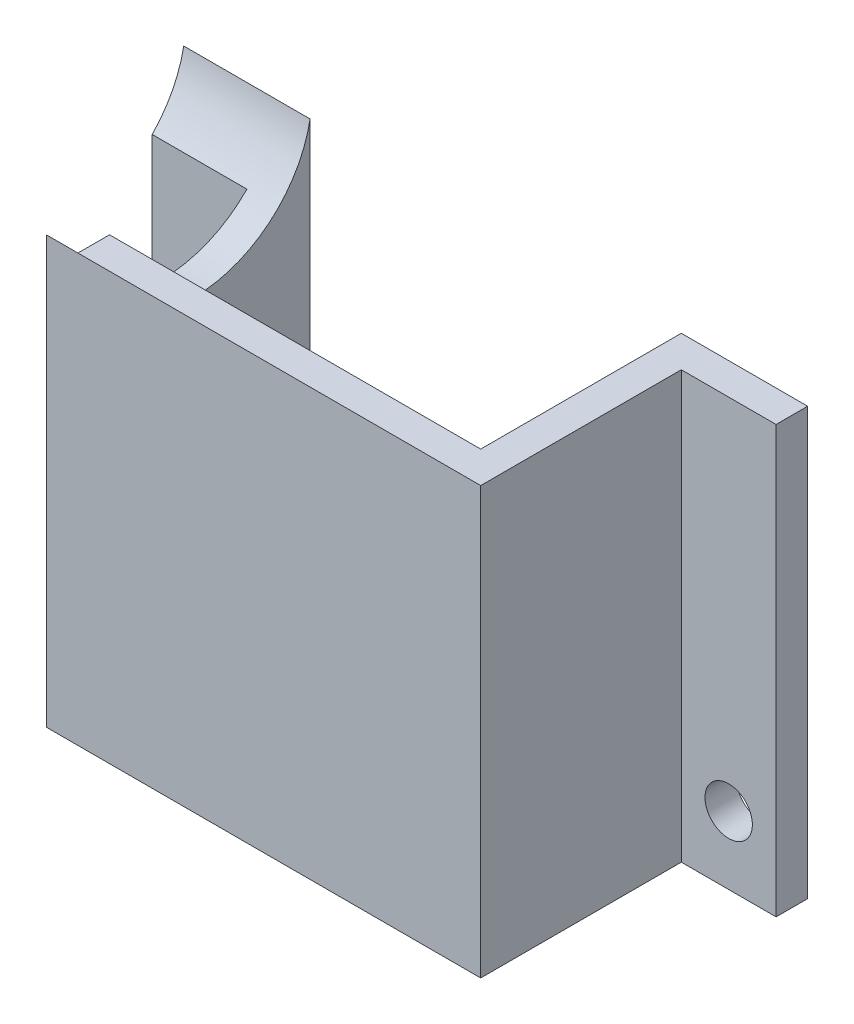
ISO-10303-21;
HEADER;
FILE_DESCRIPTION(('STEP AP214'),'2;1');
FILE_NAME('part.step','',(''),(''),'','','');
FILE_SCHEMA(('AUTOMOTIVE_DESIGN { 1 0 10303 214 1 1 1 1 }'));
ENDSEC;
DATA;
#1=APPLICATION_CONTEXT('core data for automotive mechanical design processes');
#2=APPLICATION_PROTOCOL_DEFINITION('international standard','automotive_design',2000,#1);
#3=PRODUCT_CONTEXT('',#1,'mechanical');
#4=PRODUCT('Part','Part','',(#3));
#5=PRODUCT_RELATED_PRODUCT_CATEGORY('part','',(#4));
#6=PRODUCT_DEFINITION_FORMATION('','',#4);
#7=PRODUCT_DEFINITION_CONTEXT('part definition',#1,'design');
#8=PRODUCT_DEFINITION('design','',#6,#7);
#9=PRODUCT_DEFINITION_SHAPE('','',#8);
#10=(LENGTH_UNIT() NAMED_UNIT(*) SI_UNIT(.MILLI.,.METRE.));
#11=(NAMED_UNIT(*) PLANE_ANGLE_UNIT() SI_UNIT($,.RADIAN.));
#12=(NAMED_UNIT(*) SI_UNIT($,.STERADIAN.) SOLID_ANGLE_UNIT());
#13=UNCERTAINTY_MEASURE_WITH_UNIT(LENGTH_MEASURE(1.E-05),#10,'distance_accuracy_value','');
#14=(GEOMETRIC_REPRESENTATION_CONTEXT(3) GLOBAL_UNCERTAINTY_ASSIGNED_CONTEXT((#13)) GLOBAL_UNIT_ASSIGNED_CONTEXT((#10,
#11,#12)) REPRESENTATION_CONTEXT('',''));
#15=CARTESIAN_POINT('',(0.,0.,0.));
#16=DIRECTION('',(0.,0.,1.));
#17=DIRECTION('',(1.,0.,0.));
#18=AXIS2_PLACEMENT_3D('',#15,#16,#17);
#19=CARTESIAN_POINT('',(-18.2057416267943,-20.2177033492823,12.7));
#20=DIRECTION('',(1.,0.,0.));
#21=DIRECTION('',(0.,0.,-1.));
#22=AXIS2_PLACEMENT_3D('',#19,#20,#21);
#23=PLANE('',#22);
#24=CARTESIAN_POINT('',(-18.2057416267943,8.15687405460447,7.35));
#25=DIRECTION('',(1.,0.,0.));
#26=DIRECTION('',(0.,0.,-1.));
#27=AXIS2_PLACEMENT_3D('',#24,#25,#26);
#28=CIRCLE('',#27,7.47743024302307);
#29=CARTESIAN_POINT('',(-18.2057416267943,6.7822966507177,0.));
#30=VERTEX_POINT('',#29);
#31=CARTESIAN_POINT('',(-18.2057416267943,2.93294229401685,2.));
#32=VERTEX_POINT('',#31);
#33=EDGE_CURVE('E317',#30,#32,#28,.F.);
#34=ORIENTED_EDGE('',*,*,#33,.F.);
#35=DIRECTION('',(0.,-1.,0.));
#36=VECTOR('',#35,1.);
#37=CARTESIAN_POINT('',(-18.2057416267943,-20.2177033492823,0.));
#38=LINE('',#37,#36);
#39=CARTESIAN_POINT('',(-18.2057416267943,-20.2177033492823,0.));
#40=VERTEX_POINT('',#39);
#41=EDGE_CURVE('E196',#30,#40,#38,.T.);
#42=ORIENTED_EDGE('',*,*,#41,.T.);
#43=DIRECTION('',(0.,0.,-1.));
#44=VECTOR('',#43,1.);
#45=CARTESIAN_POINT('',(-18.2057416267943,-20.2177033492823,12.7));
#46=LINE('',#45,#44);
#47=CARTESIAN_POINT('',(-18.2057416267943,-20.2177033492823,2.));
#48=VERTEX_POINT('',#47);
#49=EDGE_CURVE('E48',#48,#40,#46,.T.);
#50=ORIENTED_EDGE('',*,*,#49,.F.);
#51=DIRECTION('',(0.,1.,0.));
#52=VECTOR('',#51,1.);
#53=CARTESIAN_POINT('',(-18.2057416267943,-20.2177033492823,2.));
#54=LINE('',#53,#52);
#55=EDGE_CURVE('E203',#48,#32,#54,.T.);
#56=ORIENTED_EDGE('',*,*,#55,.T.);
#57=EDGE_LOOP('',(#34,#42,#50,#56));
#58=FACE_BOUND('',#57,.T.);
#59=ADVANCED_FACE('F39',(#58),#23,.F.);
#60=CARTESIAN_POINT('',(13.2942583732057,6.78229665071771,12.7));
#61=DIRECTION('',(0.,-1.,0.));
#62=DIRECTION('',(0.,0.,-1.));
#63=AXIS2_PLACEMENT_3D('',#60,#61,#62);
#64=PLANE('',#63);
#65=DIRECTION('',(0.,0.,-1.));
#66=VECTOR('',#65,1.);
#67=CARTESIAN_POINT('',(-10.2057416267943,6.78229665071771,12.7));
#68=LINE('',#67,#66);
#69=CARTESIAN_POINT('',(-10.2057416267943,6.78229665071771,14.7));
#70=VERTEX_POINT('',#69);
#71=CARTESIAN_POINT('',(-10.2057416267943,6.78229665071771,12.7));
#72=VERTEX_POINT('',#71);
#73=EDGE_CURVE('E161',#70,#72,#68,.T.);
#74=ORIENTED_EDGE('',*,*,#73,.F.);
#75=DIRECTION('',(-1.,0.,0.));
#76=VECTOR('',#75,1.);
#77=CARTESIAN_POINT('',(-18.2057416267943,6.78229665071771,14.7));
#78=LINE('',#77,#76);
#79=CARTESIAN_POINT('',(15.2942583732057,6.78229665071771,14.7));
#80=VERTEX_POINT('',#79);
#81=EDGE_CURVE('E182',#80,#70,#78,.T.);
#82=ORIENTED_EDGE('',*,*,#81,.F.);
#83=DIRECTION('',(0.,0.,1.));
#84=VECTOR('',#83,1.);
#85=CARTESIAN_POINT('',(15.2942583732057,6.78229665071771,14.7));
#86=LINE('',#85,#84);
#87=CARTESIAN_POINT('',(15.2942583732057,6.78229665071771,2.));
#88=VERTEX_POINT('',#87);
#89=EDGE_CURVE('E62',#88,#80,#86,.T.);
#90=ORIENTED_EDGE('',*,*,#89,.F.);
#91=DIRECTION('',(-1.,0.,0.));
#92=VECTOR('',#91,1.);
#93=CARTESIAN_POINT('',(15.2942583732057,6.78229665071771,2.));
#94=LINE('',#93,#92);
#95=CARTESIAN_POINT('',(21.2942583732058,6.78229665071771,2.));
#96=VERTEX_POINT('',#95);
#97=EDGE_CURVE('E339',#96,#88,#94,.T.);
#98=ORIENTED_EDGE('',*,*,#97,.F.);
#99=DIRECTION('',(0.,0.,-1.));
#100=VECTOR('',#99,1.);
#101=CARTESIAN_POINT('',(21.2942583732057,6.78229665071771,12.7));
#102=LINE('',#101,#100);
#103=CARTESIAN_POINT('',(21.2942583732057,6.78229665071771,0.));
#104=VERTEX_POINT('',#103);
#105=EDGE_CURVE('E296',#96,#104,#102,.T.);
#106=ORIENTED_EDGE('',*,*,#105,.T.);
#107=DIRECTION('',(-1.,0.,0.));
#108=VECTOR('',#107,1.);
#109=CARTESIAN_POINT('',(13.2942583732057,6.78229665071771,0.));
#110=LINE('',#109,#108);
#111=CARTESIAN_POINT('',(13.2942583732057,6.78229665071771,0.));
#112=VERTEX_POINT('',#111);
#113=EDGE_CURVE('E245',#104,#112,#110,.T.);
#114=ORIENTED_EDGE('',*,*,#113,.T.);
#115=DIRECTION('',(0.,0.,-1.));
#116=VECTOR('',#115,1.);
#117=CARTESIAN_POINT('',(13.2942583732057,6.78229665071771,12.7));
#118=LINE('',#117,#116);
#119=CARTESIAN_POINT('',(13.2942583732057,6.78229665071771,12.7));
#120=VERTEX_POINT('',#119);
#121=EDGE_CURVE('E292',#120,#112,#118,.T.);
#122=ORIENTED_EDGE('',*,*,#121,.F.);
#123=DIRECTION('',(-1.,0.,0.));
#124=VECTOR('',#123,1.);
#125=CARTESIAN_POINT('',(-18.2057416267943,6.78229665071771,12.7));
#126=LINE('',#125,#124);
#127=EDGE_CURVE('E184',#120,#72,#126,.T.);
#128=ORIENTED_EDGE('',*,*,#127,.T.);
#129=EDGE_LOOP('',(#74,#82,#90,#98,#106,#114,#122,#128));
#130=FACE_BOUND('',#129,.T.);
#131=ADVANCED_FACE('F181',(#130),#64,.F.);
#132=CARTESIAN_POINT('',(-10.2057416267943,6.78229665071771,12.7));
#133=DIRECTION('',(-1.,0.,0.));
#134=DIRECTION('',(0.,-1.,0.));
#135=AXIS2_PLACEMENT_3D('',#132,#133,#134);
#136=PLANE('',#135);
#137=CARTESIAN_POINT('',(-10.2057416267943,8.15687405460447,7.35));
#138=DIRECTION('',(-1.,0.,0.));
#139=DIRECTION('',(0.,-1.,0.));
#140=AXIS2_PLACEMENT_3D('',#137,#138,#139);
#141=CIRCLE('',#140,7.47743024302307);
#142=CARTESIAN_POINT('',(-10.2057416267943,6.7822966507177,0.));
#143=VERTEX_POINT('',#142);
#144=CARTESIAN_POINT('',(-10.2057416267943,2.93294229401685,12.7));
#145=VERTEX_POINT('',#144);
#146=EDGE_CURVE('E166',#143,#145,#141,.T.);
#147=ORIENTED_EDGE('',*,*,#146,.T.);
#148=DIRECTION('',(0.,1.,0.));
#149=VECTOR('',#148,1.);
#150=CARTESIAN_POINT('',(-10.2057416267943,6.78229665071771,12.7));
#151=LINE('',#150,#149);
#152=CARTESIAN_POINT('',(-10.2057416267943,-6.7177033492823,12.7));
#153=VERTEX_POINT('',#152);
#154=EDGE_CURVE('E229',#153,#145,#151,.T.);
#155=ORIENTED_EDGE('',*,*,#154,.F.);
#156=DIRECTION('',(0.,0.,-1.));
#157=VECTOR('',#156,1.);
#158=CARTESIAN_POINT('',(-10.2057416267943,-6.7177033492823,12.7));
#159=LINE('',#158,#157);
#160=CARTESIAN_POINT('',(-10.2057416267943,-6.7177033492823,0.));
#161=VERTEX_POINT('',#160);
#162=EDGE_CURVE('E232',#153,#161,#159,.T.);
#163=ORIENTED_EDGE('',*,*,#162,.T.);
#164=DIRECTION('',(0.,1.,0.));
#165=VECTOR('',#164,1.);
#166=CARTESIAN_POINT('',(-10.2057416267943,6.78229665071771,0.));
#167=LINE('',#166,#165);
#168=EDGE_CURVE('E209',#161,#143,#167,.T.);
#169=ORIENTED_EDGE('',*,*,#168,.T.);
#170=EDGE_LOOP('',(#147,#155,#163,#169));
#171=FACE_BOUND('',#170,.T.);
#172=ADVANCED_FACE('F427',(#171),#136,.F.);
#173=CARTESIAN_POINT('',(-12.2057416267943,-20.2177033492823,2.));
#174=DIRECTION('',(0.,0.,-1.));
#175=DIRECTION('',(-1.,0.,0.));
#176=AXIS2_PLACEMENT_3D('',#173,#174,#175);
#177=PLANE('',#176);
#178=CARTESIAN_POINT('',(-15.2057416267943,-15.9173811177198,2.));
#179=DIRECTION('',(0.,0.,-1.));
#180=DIRECTION('',(-1.,0.,0.));
#181=AXIS2_PLACEMENT_3D('',#178,#179,#180);
#182=CIRCLE('',#181,1.5);
#183=CARTESIAN_POINT('',(-16.7057416267943,-15.9173811177198,2.));
#184=VERTEX_POINT('',#183);
#185=EDGE_CURVE('E167',#184,#184,#182,.T.);
#186=ORIENTED_EDGE('',*,*,#185,.T.);
#187=EDGE_LOOP('',(#186));
#188=FACE_BOUND('',#187,.T.);
#189=DIRECTION('',(1.,0.,0.));
#190=VECTOR('',#189,1.);
#191=CARTESIAN_POINT('',(-22.2057416267943,2.93294229401685,2.));
#192=LINE('',#191,#190);
#193=CARTESIAN_POINT('',(-12.2057416267943,2.93294229401685,2.));
#194=VERTEX_POINT('',#193);
#195=EDGE_CURVE('E54',#32,#194,#192,.T.);
#196=ORIENTED_EDGE('',*,*,#195,.F.);
#197=ORIENTED_EDGE('',*,*,#55,.F.);
#198=DIRECTION('',(-1.,0.,0.));
#199=VECTOR('',#198,1.);
#200=CARTESIAN_POINT('',(-12.2057416267943,-20.2177033492823,2.));
#201=LINE('',#200,#199);
#202=CARTESIAN_POINT('',(-12.2057416267943,-20.2177033492823,2.));
#203=VERTEX_POINT('',#202);
#204=EDGE_CURVE('E312',#203,#48,#201,.T.);
#205=ORIENTED_EDGE('',*,*,#204,.F.);
#206=DIRECTION('',(0.,1.,0.));
#207=VECTOR('',#206,1.);
#208=CARTESIAN_POINT('',(-12.2057416267943,-20.2177033492823,2.));
#209=LINE('',#208,#207);
#210=EDGE_CURVE('E384',#203,#194,#209,.T.);
#211=ORIENTED_EDGE('',*,*,#210,.T.);
#212=EDGE_LOOP('',(#196,#197,#205,#211));
#213=FACE_BOUND('',#212,.T.);
#214=ADVANCED_FACE('F391',(#188,#213),#177,.F.);
#215=CARTESIAN_POINT('',(-12.2057416267943,-20.2177033492823,14.7));
#216=DIRECTION('',(1.,0.,0.));
#217=DIRECTION('',(0.,0.,-1.));
#218=AXIS2_PLACEMENT_3D('',#215,#216,#217);
#219=PLANE('',#218);
#220=CARTESIAN_POINT('',(-12.2057416267943,8.15687405460447,7.35));
#221=DIRECTION('',(1.,0.,0.));
#222=DIRECTION('',(0.,0.,-1.));
#223=AXIS2_PLACEMENT_3D('',#220,#221,#222);
#224=CIRCLE('',#223,7.47743024302307);
#225=CARTESIAN_POINT('',(-12.2057416267943,6.78229665071771,14.7));
#226=VERTEX_POINT('',#225);
#227=EDGE_CURVE('E11',#194,#226,#224,.F.);
#228=ORIENTED_EDGE('',*,*,#227,.F.);
#229=ORIENTED_EDGE('',*,*,#210,.F.);
#230=DIRECTION('',(0.,0.,-1.));
#231=VECTOR('',#230,1.);
#232=CARTESIAN_POINT('',(-12.2057416267943,-20.2177033492823,14.7));
#233=LINE('',#232,#231);
#234=CARTESIAN_POINT('',(-12.2057416267943,-20.2177033492823,14.7));
#235=VERTEX_POINT('',#234);
#236=EDGE_CURVE('E351',#235,#203,#233,.T.);
#237=ORIENTED_EDGE('',*,*,#236,.F.);
#238=DIRECTION('',(0.,1.,0.));
#239=VECTOR('',#238,1.);
#240=CARTESIAN_POINT('',(-12.2057416267943,-20.2177033492823,14.7));
#241=LINE('',#240,#239);
#242=EDGE_CURVE('E381',#235,#226,#241,.T.);
#243=ORIENTED_EDGE('',*,*,#242,.T.);
#244=EDGE_LOOP('',(#228,#229,#237,#243));
#245=FACE_BOUND('',#244,.T.);
#246=ADVANCED_FACE('F389',(#245),#219,.F.);
#247=CARTESIAN_POINT('',(21.2942583732058,-20.2177033492823,12.7));
#248=DIRECTION('',(0.,1.,0.));
#249=DIRECTION('',(-1.,0.,0.));
#250=AXIS2_PLACEMENT_3D('',#247,#248,#249);
#251=PLANE('',#250);
#252=ORIENTED_EDGE('',*,*,#236,.T.);
#253=ORIENTED_EDGE('',*,*,#204,.T.);
#254=ORIENTED_EDGE('',*,*,#49,.T.);
#255=DIRECTION('',(1.,0.,0.));
#256=VECTOR('',#255,1.);
#257=CARTESIAN_POINT('',(21.2942583732058,-20.2177033492823,0.));
#258=LINE('',#257,#256);
#259=CARTESIAN_POINT('',(21.2942583732058,-20.2177033492823,0.));
#260=VERTEX_POINT('',#259);
#261=EDGE_CURVE('E237',#40,#260,#258,.T.);
#262=ORIENTED_EDGE('',*,*,#261,.T.);
#263=DIRECTION('',(0.,0.,-1.));
#264=VECTOR('',#263,1.);
#265=CARTESIAN_POINT('',(21.2942583732058,-20.2177033492823,12.7));
#266=LINE('',#265,#264);
#267=CARTESIAN_POINT('',(21.2942583732058,-20.2177033492823,2.));
#268=VERTEX_POINT('',#267);
#269=EDGE_CURVE('E299',#268,#260,#266,.T.);
#270=ORIENTED_EDGE('',*,*,#269,.F.);
#271=DIRECTION('',(-1.,0.,0.));
#272=VECTOR('',#271,1.);
#273=CARTESIAN_POINT('',(15.2942583732057,-20.2177033492823,2.));
#274=LINE('',#273,#272);
#275=CARTESIAN_POINT('',(15.2942583732057,-20.2177033492823,2.));
#276=VERTEX_POINT('',#275);
#277=EDGE_CURVE('E330',#268,#276,#274,.T.);
#278=ORIENTED_EDGE('',*,*,#277,.T.);
#279=DIRECTION('',(0.,0.,1.));
#280=VECTOR('',#279,1.);
#281=CARTESIAN_POINT('',(15.2942583732057,-20.2177033492823,14.7));
#282=LINE('',#281,#280);
#283=CARTESIAN_POINT('',(15.2942583732057,-20.2177033492823,14.7));
#284=VERTEX_POINT('',#283);
#285=EDGE_CURVE('E333',#276,#284,#282,.T.);
#286=ORIENTED_EDGE('',*,*,#285,.T.);
#287=DIRECTION('',(1.,0.,0.));
#288=VECTOR('',#287,1.);
#289=CARTESIAN_POINT('',(-18.2057416267943,-20.2177033492823,14.7));
#290=LINE('',#289,#288);
#291=EDGE_CURVE('E192',#235,#284,#290,.T.);
#292=ORIENTED_EDGE('',*,*,#291,.F.);
#293=EDGE_LOOP('',(#252,#253,#254,#262,#270,#278,#286,#292));
#294=FACE_BOUND('',#293,.T.);
#295=ADVANCED_FACE('F307',(#294),#251,.F.);
#296=CARTESIAN_POINT('',(21.2942583732057,6.78229665071771,12.7));
#297=DIRECTION('',(-1.,0.,0.));
#298=DIRECTION('',(0.,-1.,0.));
#299=AXIS2_PLACEMENT_3D('',#296,#297,#298);
#300=PLANE('',#299);
#301=ORIENTED_EDGE('',*,*,#105,.F.);
#302=DIRECTION('',(0.,1.,0.));
#303=VECTOR('',#302,1.);
#304=CARTESIAN_POINT('',(21.2942583732058,-20.2177033492823,2.));
#305=LINE('',#304,#303);
#306=EDGE_CURVE('E327',#268,#96,#305,.T.);
#307=ORIENTED_EDGE('',*,*,#306,.F.);
#308=ORIENTED_EDGE('',*,*,#269,.T.);
#309=DIRECTION('',(0.,1.,0.));
#310=VECTOR('',#309,1.);
#311=CARTESIAN_POINT('',(21.2942583732057,6.78229665071771,0.));
#312=LINE('',#311,#310);
#313=EDGE_CURVE('E241',#260,#104,#312,.T.);
#314=ORIENTED_EDGE('',*,*,#313,.T.);
#315=EDGE_LOOP('',(#301,#307,#308,#314));
#316=FACE_BOUND('',#315,.T.);
#317=ADVANCED_FACE('F325',(#316),#300,.F.);
#318=CARTESIAN_POINT('',(13.2942583732057,-6.71770334928229,12.7));
#319=DIRECTION('',(1.,0.,0.));
#320=DIRECTION('',(0.,0.,-1.));
#321=AXIS2_PLACEMENT_3D('',#318,#319,#320);
#322=PLANE('',#321);
#323=DIRECTION('',(0.,-1.,0.));
#324=VECTOR('',#323,1.);
#325=CARTESIAN_POINT('',(13.2942583732057,-6.71770334928229,0.));
#326=LINE('',#325,#324);
#327=CARTESIAN_POINT('',(13.2942583732057,-6.71770334928229,0.));
#328=VERTEX_POINT('',#327);
#329=EDGE_CURVE('E248',#112,#328,#326,.T.);
#330=ORIENTED_EDGE('',*,*,#329,.T.);
#331=DIRECTION('',(0.,0.,-1.));
#332=VECTOR('',#331,1.);
#333=CARTESIAN_POINT('',(13.2942583732057,-6.71770334928229,12.7));
#334=LINE('',#333,#332);
#335=CARTESIAN_POINT('',(13.2942583732057,-6.71770334928229,12.7));
#336=VERTEX_POINT('',#335);
#337=EDGE_CURVE('E288',#336,#328,#334,.T.);
#338=ORIENTED_EDGE('',*,*,#337,.F.);
#339=DIRECTION('',(0.,-1.,0.));
#340=VECTOR('',#339,1.);
#341=CARTESIAN_POINT('',(13.2942583732057,-6.71770334928229,12.7));
#342=LINE('',#341,#340);
#343=EDGE_CURVE('E204',#120,#336,#342,.T.);
#344=ORIENTED_EDGE('',*,*,#343,.F.);
#345=ORIENTED_EDGE('',*,*,#121,.T.);
#346=EDGE_LOOP('',(#330,#338,#344,#345));
#347=FACE_BOUND('',#346,.T.);
#348=ADVANCED_FACE('F357',(#347),#322,.F.);
#349=CARTESIAN_POINT('',(-5.00574162679425,-6.71770334928229,12.7));
#350=DIRECTION('',(0.,-1.,0.));
#351=DIRECTION('',(1.,0.,0.));
#352=AXIS2_PLACEMENT_3D('',#349,#350,#351);
#353=PLANE('',#352);
#354=DIRECTION('',(-1.,0.,0.));
#355=VECTOR('',#354,1.);
#356=CARTESIAN_POINT('',(-5.00574162679425,-6.71770334928229,0.));
#357=LINE('',#356,#355);
#358=CARTESIAN_POINT('',(-5.00574162679425,-6.71770334928229,0.));
#359=VERTEX_POINT('',#358);
#360=EDGE_CURVE('E251',#328,#359,#357,.T.);
#361=ORIENTED_EDGE('',*,*,#360,.T.);
#362=DIRECTION('',(0.,0.,-1.));
#363=VECTOR('',#362,1.);
#364=CARTESIAN_POINT('',(-5.00574162679425,-6.71770334928229,12.7));
#365=LINE('',#364,#363);
#366=CARTESIAN_POINT('',(-5.00574162679425,-6.71770334928229,12.7));
#367=VERTEX_POINT('',#366);
#368=EDGE_CURVE('E284',#367,#359,#365,.T.);
#369=ORIENTED_EDGE('',*,*,#368,.F.);
#370=DIRECTION('',(-1.,0.,0.));
#371=VECTOR('',#370,1.);
#372=CARTESIAN_POINT('',(-5.00574162679425,-6.71770334928229,12.7));
#373=LINE('',#372,#371);
#374=EDGE_CURVE('E208',#336,#367,#373,.T.);
#375=ORIENTED_EDGE('',*,*,#374,.F.);
#376=ORIENTED_EDGE('',*,*,#337,.T.);
#377=EDGE_LOOP('',(#361,#369,#375,#376));
#378=FACE_BOUND('',#377,.T.);
#379=ADVANCED_FACE('F362',(#378),#353,.F.);
#380=CARTESIAN_POINT('',(-5.00574162679425,-12.2177033492823,12.7));
#381=DIRECTION('',(1.,0.,0.));
#382=DIRECTION('',(0.,1.,0.));
#383=AXIS2_PLACEMENT_3D('',#380,#381,#382);
#384=PLANE('',#383);
#385=DIRECTION('',(0.,-1.,0.));
#386=VECTOR('',#385,1.);
#387=CARTESIAN_POINT('',(-5.00574162679425,-12.2177033492823,0.));
#388=LINE('',#387,#386);
#389=CARTESIAN_POINT('',(-5.00574162679425,-12.2177033492823,0.));
#390=VERTEX_POINT('',#389);
#391=EDGE_CURVE('E254',#359,#390,#388,.T.);
#392=ORIENTED_EDGE('',*,*,#391,.T.);
#393=DIRECTION('',(0.,0.,-1.));
#394=VECTOR('',#393,1.);
#395=CARTESIAN_POINT('',(-5.00574162679425,-12.2177033492823,12.7));
#396=LINE('',#395,#394);
#397=CARTESIAN_POINT('',(-5.00574162679425,-12.2177033492823,12.7));
#398=VERTEX_POINT('',#397);
#399=EDGE_CURVE('E280',#398,#390,#396,.T.);
#400=ORIENTED_EDGE('',*,*,#399,.F.);
#401=DIRECTION('',(0.,-1.,0.));
#402=VECTOR('',#401,1.);
#403=CARTESIAN_POINT('',(-5.00574162679425,-12.2177033492823,12.7));
#404=LINE('',#403,#402);
#405=EDGE_CURVE('E213',#367,#398,#404,.T.);
#406=ORIENTED_EDGE('',*,*,#405,.F.);
#407=ORIENTED_EDGE('',*,*,#368,.T.);
#408=EDGE_LOOP('',(#392,#400,#406,#407));
#409=FACE_BOUND('',#408,.T.);
#410=ADVANCED_FACE('F366',(#409),#384,.F.);
#411=CARTESIAN_POINT('',(-8.20574162679425,-12.2177033492823,12.7));
#412=DIRECTION('',(0.,-1.,0.));
#413=DIRECTION('',(1.,0.,0.));
#414=AXIS2_PLACEMENT_3D('',#411,#412,#413);
#415=PLANE('',#414);
#416=DIRECTION('',(-1.,0.,0.));
#417=VECTOR('',#416,1.);
#418=CARTESIAN_POINT('',(-8.20574162679425,-12.2177033492823,0.));
#419=LINE('',#418,#417);
#420=CARTESIAN_POINT('',(-8.20574162679425,-12.2177033492823,0.));
#421=VERTEX_POINT('',#420);
#422=EDGE_CURVE('E257',#390,#421,#419,.T.);
#423=ORIENTED_EDGE('',*,*,#422,.T.);
#424=DIRECTION('',(0.,0.,-1.));
#425=VECTOR('',#424,1.);
#426=CARTESIAN_POINT('',(-8.20574162679425,-12.2177033492823,12.7));
#427=LINE('',#426,#425);
#428=CARTESIAN_POINT('',(-8.20574162679425,-12.2177033492823,12.7));
#429=VERTEX_POINT('',#428);
#430=EDGE_CURVE('E276',#429,#421,#427,.T.);
#431=ORIENTED_EDGE('',*,*,#430,.F.);
#432=DIRECTION('',(-1.,0.,0.));
#433=VECTOR('',#432,1.);
#434=CARTESIAN_POINT('',(-8.20574162679425,-12.2177033492823,12.7));
#435=LINE('',#434,#433);
#436=EDGE_CURVE('E217',#398,#429,#435,.T.);
#437=ORIENTED_EDGE('',*,*,#436,.F.);
#438=ORIENTED_EDGE('',*,*,#399,.T.);
#439=EDGE_LOOP('',(#423,#431,#437,#438));
#440=FACE_BOUND('',#439,.T.);
#441=ADVANCED_FACE('F468',(#440),#415,.F.);
#442=CARTESIAN_POINT('',(-8.20574162679425,-6.7177033492823,12.7));
#443=DIRECTION('',(-1.,0.,0.));
#444=DIRECTION('',(0.,0.,1.));
#445=AXIS2_PLACEMENT_3D('',#442,#443,#444);
#446=PLANE('',#445);
#447=DIRECTION('',(0.,1.,0.));
#448=VECTOR('',#447,1.);
#449=CARTESIAN_POINT('',(-8.20574162679425,-6.7177033492823,0.));
#450=LINE('',#449,#448);
#451=CARTESIAN_POINT('',(-8.20574162679425,-6.7177033492823,0.));
#452=VERTEX_POINT('',#451);
#453=EDGE_CURVE('E260',#421,#452,#450,.T.);
#454=ORIENTED_EDGE('',*,*,#453,.T.);
#455=DIRECTION('',(0.,0.,-1.));
#456=VECTOR('',#455,1.);
#457=CARTESIAN_POINT('',(-8.20574162679425,-6.7177033492823,12.7));
#458=LINE('',#457,#456);
#459=CARTESIAN_POINT('',(-8.20574162679425,-6.7177033492823,12.7));
#460=VERTEX_POINT('',#459);
#461=EDGE_CURVE('E272',#460,#452,#458,.T.);
#462=ORIENTED_EDGE('',*,*,#461,.F.);
#463=DIRECTION('',(0.,1.,0.));
#464=VECTOR('',#463,1.);
#465=CARTESIAN_POINT('',(-8.20574162679425,-6.7177033492823,12.7));
#466=LINE('',#465,#464);
#467=EDGE_CURVE('E221',#429,#460,#466,.T.);
#468=ORIENTED_EDGE('',*,*,#467,.F.);
#469=ORIENTED_EDGE('',*,*,#430,.T.);
#470=EDGE_LOOP('',(#454,#462,#468,#469));
#471=FACE_BOUND('',#470,.T.);
#472=ADVANCED_FACE('F464',(#471),#446,.F.);
#473=CARTESIAN_POINT('',(-10.2057416267943,-6.7177033492823,12.7));
#474=DIRECTION('',(0.,-1.,0.));
#475=DIRECTION('',(0.,0.,-1.));
#476=AXIS2_PLACEMENT_3D('',#473,#474,#475);
#477=PLANE('',#476);
#478=DIRECTION('',(-1.,0.,0.));
#479=VECTOR('',#478,1.);
#480=CARTESIAN_POINT('',(-10.2057416267943,-6.7177033492823,0.));
#481=LINE('',#480,#479);
#482=EDGE_CURVE('E263',#452,#161,#481,.T.);
#483=ORIENTED_EDGE('',*,*,#482,.T.);
#484=ORIENTED_EDGE('',*,*,#162,.F.);
#485=DIRECTION('',(-1.,0.,0.));
#486=VECTOR('',#485,1.);
#487=CARTESIAN_POINT('',(-10.2057416267943,-6.7177033492823,12.7));
#488=LINE('',#487,#486);
#489=EDGE_CURVE('E225',#460,#153,#488,.T.);
#490=ORIENTED_EDGE('',*,*,#489,.F.);
#491=ORIENTED_EDGE('',*,*,#461,.T.);
#492=EDGE_LOOP('',(#483,#484,#490,#491));
#493=FACE_BOUND('',#492,.T.);
#494=ADVANCED_FACE('F459',(#493),#477,.F.);
#495=CARTESIAN_POINT('',(0.,0.,0.));
#496=DIRECTION('',(0.,0.,-1.));
#497=DIRECTION('',(-1.,0.,0.));
#498=AXIS2_PLACEMENT_3D('',#495,#496,#497);
#499=PLANE('',#498);
#500=CARTESIAN_POINT('',(18.2942583732058,-15.9173811177198,0.));
#501=DIRECTION('',(0.,0.,-1.));
#502=DIRECTION('',(-1.,0.,0.));
#503=AXIS2_PLACEMENT_3D('',#500,#501,#502);
#504=CIRCLE('',#503,1.5);
#505=CARTESIAN_POINT('',(16.7942583732058,-15.9173811177198,0.));
#506=VERTEX_POINT('',#505);
#507=EDGE_CURVE('E402',#506,#506,#504,.T.);
#508=ORIENTED_EDGE('',*,*,#507,.F.);
#509=EDGE_LOOP('',(#508));
#510=FACE_BOUND('',#509,.T.);
#511=CARTESIAN_POINT('',(-15.2057416267943,-15.9173811177198,0.));
#512=DIRECTION('',(0.,0.,-1.));
#513=DIRECTION('',(-1.,0.,0.));
#514=AXIS2_PLACEMENT_3D('',#511,#512,#513);
#515=CIRCLE('',#514,1.5);
#516=CARTESIAN_POINT('',(-16.7057416267943,-15.9173811177198,0.));
#517=VERTEX_POINT('',#516);
#518=EDGE_CURVE('E398',#517,#517,#515,.T.);
#519=ORIENTED_EDGE('',*,*,#518,.F.);
#520=EDGE_LOOP('',(#519));
#521=FACE_BOUND('',#520,.T.);
#522=DIRECTION('',(-1.,0.,0.));
#523=VECTOR('',#522,1.);
#524=CARTESIAN_POINT('',(-18.2057416267943,6.78229665071771,0.));
#525=LINE('',#524,#523);
#526=EDGE_CURVE('E191',#143,#30,#525,.T.);
#527=ORIENTED_EDGE('',*,*,#526,.F.);
#528=ORIENTED_EDGE('',*,*,#168,.F.);
#529=ORIENTED_EDGE('',*,*,#482,.F.);
#530=ORIENTED_EDGE('',*,*,#453,.F.);
#531=ORIENTED_EDGE('',*,*,#422,.F.);
#532=ORIENTED_EDGE('',*,*,#391,.F.);
#533=ORIENTED_EDGE('',*,*,#360,.F.);
#534=ORIENTED_EDGE('',*,*,#329,.F.);
#535=ORIENTED_EDGE('',*,*,#113,.F.);
#536=ORIENTED_EDGE('',*,*,#313,.F.);
#537=ORIENTED_EDGE('',*,*,#261,.F.);
#538=ORIENTED_EDGE('',*,*,#41,.F.);
#539=EDGE_LOOP('',(#527,#528,#529,#530,#531,#532,#533,#534,#535,#536,#537,#538));
#540=FACE_BOUND('',#539,.T.);
#541=ADVANCED_FACE('F320',(#510,#521,#540),#499,.T.);
#542=CARTESIAN_POINT('',(0.,0.,12.7));
#543=DIRECTION('',(0.,0.,1.));
#544=DIRECTION('',(1.,0.,0.));
#545=AXIS2_PLACEMENT_3D('',#542,#543,#544);
#546=PLANE('',#545);
#547=ORIENTED_EDGE('',*,*,#127,.F.);
#548=ORIENTED_EDGE('',*,*,#343,.T.);
#549=ORIENTED_EDGE('',*,*,#374,.T.);
#550=ORIENTED_EDGE('',*,*,#405,.T.);
#551=ORIENTED_EDGE('',*,*,#436,.T.);
#552=ORIENTED_EDGE('',*,*,#467,.T.);
#553=ORIENTED_EDGE('',*,*,#489,.T.);
#554=ORIENTED_EDGE('',*,*,#154,.T.);
#555=DIRECTION('',(0.,-1.,0.));
#556=VECTOR('',#555,1.);
#557=CARTESIAN_POINT('',(-10.2057416267943,0.,12.7));
#558=LINE('',#557,#556);
#559=EDGE_CURVE('E163',#72,#145,#558,.T.);
#560=ORIENTED_EDGE('',*,*,#559,.F.);
#561=EDGE_LOOP('',(#547,#548,#549,#550,#551,#552,#553,#554,#560));
#562=FACE_BOUND('',#561,.T.);
#563=ADVANCED_FACE('F369',(#562),#546,.F.);
#564=CARTESIAN_POINT('',(0.,0.,14.7));
#565=DIRECTION('',(0.,0.,1.));
#566=DIRECTION('',(1.,0.,0.));
#567=AXIS2_PLACEMENT_3D('',#564,#565,#566);
#568=PLANE('',#567);
#569=ORIENTED_EDGE('',*,*,#242,.F.);
#570=ORIENTED_EDGE('',*,*,#291,.T.);
#571=DIRECTION('',(0.,1.,0.));
#572=VECTOR('',#571,1.);
#573=CARTESIAN_POINT('',(15.2942583732057,-20.2177033492823,14.7));
#574=LINE('',#573,#572);
#575=EDGE_CURVE('E189',#284,#80,#574,.T.);
#576=ORIENTED_EDGE('',*,*,#575,.T.);
#577=ORIENTED_EDGE('',*,*,#81,.T.);
#578=DIRECTION('',(1.,0.,0.));
#579=VECTOR('',#578,1.);
#580=CARTESIAN_POINT('',(-22.2057416267943,6.78229665071771,14.7));
#581=LINE('',#580,#579);
#582=EDGE_CURVE('E170',#226,#70,#581,.T.);
#583=ORIENTED_EDGE('',*,*,#582,.F.);
#584=EDGE_LOOP('',(#569,#570,#576,#577,#583));
#585=FACE_BOUND('',#584,.T.);
#586=ADVANCED_FACE('F187',(#585),#568,.T.);
#587=CARTESIAN_POINT('',(15.2942583732057,-20.2177033492823,14.7));
#588=DIRECTION('',(-1.,0.,0.));
#589=DIRECTION('',(0.,0.,1.));
#590=AXIS2_PLACEMENT_3D('',#587,#588,#589);
#591=PLANE('',#590);
#592=ORIENTED_EDGE('',*,*,#89,.T.);
#593=ORIENTED_EDGE('',*,*,#575,.F.);
#594=ORIENTED_EDGE('',*,*,#285,.F.);
#595=DIRECTION('',(0.,1.,0.));
#596=VECTOR('',#595,1.);
#597=CARTESIAN_POINT('',(15.2942583732057,-20.2177033492823,2.));
#598=LINE('',#597,#596);
#599=EDGE_CURVE('E348',#276,#88,#598,.T.);
#600=ORIENTED_EDGE('',*,*,#599,.T.);
#601=EDGE_LOOP('',(#592,#593,#594,#600));
#602=FACE_BOUND('',#601,.T.);
#603=ADVANCED_FACE('F451',(#602),#591,.F.);
#604=CARTESIAN_POINT('',(15.2942583732057,-20.2177033492823,2.));
#605=DIRECTION('',(0.,0.,-1.));
#606=DIRECTION('',(-1.,0.,0.));
#607=AXIS2_PLACEMENT_3D('',#604,#605,#606);
#608=PLANE('',#607);
#609=CARTESIAN_POINT('',(18.2942583732058,-15.9173811177198,2.));
#610=DIRECTION('',(0.,0.,-1.));
#611=DIRECTION('',(-1.,0.,0.));
#612=AXIS2_PLACEMENT_3D('',#609,#610,#611);
#613=CIRCLE('',#612,1.5);
#614=CARTESIAN_POINT('',(16.7942583732058,-15.9173811177198,2.));
#615=VERTEX_POINT('',#614);
#616=EDGE_CURVE('E42',#615,#615,#613,.T.);
#617=ORIENTED_EDGE('',*,*,#616,.T.);
#618=EDGE_LOOP('',(#617));
#619=FACE_BOUND('',#618,.T.);
#620=ORIENTED_EDGE('',*,*,#97,.T.);
#621=ORIENTED_EDGE('',*,*,#599,.F.);
#622=ORIENTED_EDGE('',*,*,#277,.F.);
#623=ORIENTED_EDGE('',*,*,#306,.T.);
#624=EDGE_LOOP('',(#620,#621,#622,#623));
#625=FACE_BOUND('',#624,.T.);
#626=ADVANCED_FACE('F354',(#619,#625),#608,.F.);
#627=CARTESIAN_POINT('',(-10.2057416267943,8.15687405460447,7.35));
#628=DIRECTION('',(-1.,0.,0.));
#629=DIRECTION('',(0.,-1.,0.));
#630=AXIS2_PLACEMENT_3D('',#627,#628,#629);
#631=PLANE('',#630);
#632=ORIENTED_EDGE('',*,*,#559,.T.);
#633=EDGE_CURVE('E157',#145,#70,#141,.T.);
#634=ORIENTED_EDGE('',*,*,#633,.T.);
#635=ORIENTED_EDGE('',*,*,#73,.T.);
#636=EDGE_LOOP('',(#632,#634,#635));
#637=FACE_BOUND('',#636,.T.);
#638=ADVANCED_FACE('F159',(#637),#631,.T.);
#639=CARTESIAN_POINT('',(-22.2057416267943,8.15687405460447,7.35));
#640=DIRECTION('',(1.,0.,0.));
#641=DIRECTION('',(0.,0.,-1.));
#642=AXIS2_PLACEMENT_3D('',#639,#640,#641);
#643=CYLINDRICAL_SURFACE('',#642,7.47743024302307);
#644=ORIENTED_EDGE('',*,*,#33,.T.);
#645=ORIENTED_EDGE('',*,*,#195,.T.);
#646=ORIENTED_EDGE('',*,*,#227,.T.);
#647=ORIENTED_EDGE('',*,*,#582,.T.);
#648=ORIENTED_EDGE('',*,*,#633,.F.);
#649=ORIENTED_EDGE('',*,*,#146,.F.);
#650=ORIENTED_EDGE('',*,*,#526,.T.);
#651=EDGE_LOOP('',(#644,#645,#646,#647,#648,#649,#650));
#652=FACE_BOUND('',#651,.T.);
#653=ADVANCED_FACE('F171',(#652),#643,.F.);
#654=CARTESIAN_POINT('',(18.2942583732058,-15.9173811177198,14.7));
#655=DIRECTION('',(0.,0.,-1.));
#656=DIRECTION('',(-1.,0.,0.));
#657=AXIS2_PLACEMENT_3D('',#654,#655,#656);
#658=CYLINDRICAL_SURFACE('',#657,1.5);
#659=ORIENTED_EDGE('',*,*,#507,.T.);
#660=EDGE_LOOP('',(#659));
#661=FACE_BOUND('',#660,.T.);
#662=ORIENTED_EDGE('',*,*,#616,.F.);
#663=EDGE_LOOP('',(#662));
#664=FACE_BOUND('',#663,.T.);
#665=ADVANCED_FACE('F412',(#661,#664),#658,.F.);
#666=CARTESIAN_POINT('',(-15.2057416267943,-15.9173811177198,14.7));
#667=DIRECTION('',(0.,0.,-1.));
#668=DIRECTION('',(-1.,0.,0.));
#669=AXIS2_PLACEMENT_3D('',#666,#667,#668);
#670=CYLINDRICAL_SURFACE('',#669,1.5);
#671=ORIENTED_EDGE('',*,*,#518,.T.);
#672=EDGE_LOOP('',(#671));
#673=FACE_BOUND('',#672,.T.);
#674=ORIENTED_EDGE('',*,*,#185,.F.);
#675=EDGE_LOOP('',(#674));
#676=FACE_BOUND('',#675,.T.);
#677=ADVANCED_FACE('F414',(#673,#676),#670,.F.);
#678=CLOSED_SHELL('',(#59,#131,#172,#214,#246,#295,#317,#348,#379,#410,#441,#472,#494,#541,#563,
#586,#603,#626,#638,#653,#665,#677));
#679=MANIFOLD_SOLID_BREP('B2',#678);
#680=ADVANCED_BREP_SHAPE_REPRESENTATION('',(#18,#679),#14);
#681=SHAPE_DEFINITION_REPRESENTATION(#9,#680);
ENDSEC;
END-ISO-10303-21;
